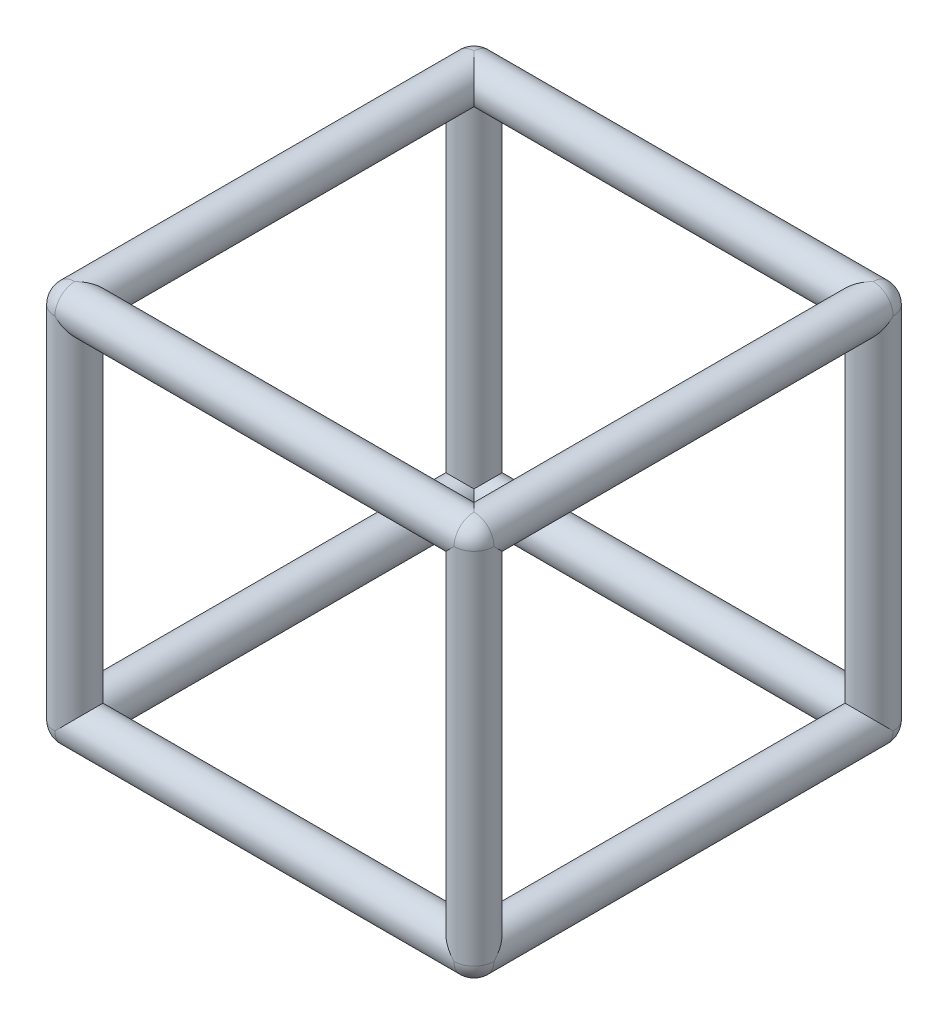
ISO-10303-21;
HEADER;
FILE_DESCRIPTION(('STEP AP214'),'2;1');
FILE_NAME('part.step','',(''),(''),'','','');
FILE_SCHEMA(('AUTOMOTIVE_DESIGN { 1 0 10303 214 1 1 1 1 }'));
ENDSEC;
DATA;
#1=APPLICATION_CONTEXT('core data for automotive mechanical design processes');
#2=APPLICATION_PROTOCOL_DEFINITION('international standard','automotive_design',2000,#1);
#3=PRODUCT_CONTEXT('',#1,'mechanical');
#4=PRODUCT('Part','Part','',(#3));
#5=PRODUCT_RELATED_PRODUCT_CATEGORY('part','',(#4));
#6=PRODUCT_DEFINITION_FORMATION('','',#4);
#7=PRODUCT_DEFINITION_CONTEXT('part definition',#1,'design');
#8=PRODUCT_DEFINITION('design','',#6,#7);
#9=PRODUCT_DEFINITION_SHAPE('','',#8);
#10=(LENGTH_UNIT() NAMED_UNIT(*) SI_UNIT(.MILLI.,.METRE.));
#11=(NAMED_UNIT(*) PLANE_ANGLE_UNIT() SI_UNIT($,.RADIAN.));
#12=(NAMED_UNIT(*) SI_UNIT($,.STERADIAN.) SOLID_ANGLE_UNIT());
#13=UNCERTAINTY_MEASURE_WITH_UNIT(LENGTH_MEASURE(1.E-05),#10,'distance_accuracy_value','');
#14=(GEOMETRIC_REPRESENTATION_CONTEXT(3) GLOBAL_UNCERTAINTY_ASSIGNED_CONTEXT((#13)) GLOBAL_UNIT_ASSIGNED_CONTEXT((#10,
#11,#12)) REPRESENTATION_CONTEXT('',''));
#15=CARTESIAN_POINT('',(0.,0.,0.));
#16=DIRECTION('',(0.,0.,1.));
#17=DIRECTION('',(1.,0.,0.));
#18=AXIS2_PLACEMENT_3D('',#15,#16,#17);
#19=CARTESIAN_POINT('',(-127.,254.,-127.));
#20=DIRECTION('',(0.,-1.,0.));
#21=DIRECTION('',(0.,0.,-1.));
#22=AXIS2_PLACEMENT_3D('',#19,#20,#21);
#23=CYLINDRICAL_SURFACE('',#22,12.7);
#24=CARTESIAN_POINT('',(-127.,241.3,-127.));
#25=DIRECTION('',(0.,-0.707106781186547,-0.707106781186547));
#26=DIRECTION('',(0.,-0.707106781186547,0.707106781186547));
#27=AXIS2_PLACEMENT_3D('',#24,#25,#26);
#28=ELLIPSE('',#27,17.9605122421383,12.7);
#29=CARTESIAN_POINT('',(-139.7,241.3,-127.));
#30=VERTEX_POINT('',#29);
#31=CARTESIAN_POINT('',(-118.019743878931,232.319743878931,-118.019743878931));
#32=VERTEX_POINT('',#31);
#33=EDGE_CURVE('E242',#30,#32,#28,.F.);
#34=ORIENTED_EDGE('',*,*,#33,.F.);
#35=CARTESIAN_POINT('',(-127.,241.3,-127.));
#36=DIRECTION('',(0.,-1.,0.));
#37=DIRECTION('',(0.,0.,-1.));
#38=AXIS2_PLACEMENT_3D('',#35,#36,#37);
#39=CIRCLE('',#38,12.7);
#40=CARTESIAN_POINT('',(-127.,241.3,-139.7));
#41=VERTEX_POINT('',#40);
#42=EDGE_CURVE('E262',#30,#41,#39,.T.);
#43=ORIENTED_EDGE('',*,*,#42,.T.);
#44=CARTESIAN_POINT('',(-127.,241.3,-127.));
#45=DIRECTION('',(-0.707106781186547,-0.707106781186547,0.));
#46=DIRECTION('',(0.707106781186547,-0.707106781186547,0.));
#47=AXIS2_PLACEMENT_3D('',#44,#45,#46);
#48=ELLIPSE('',#47,17.9605122421383,12.7);
#49=EDGE_CURVE('E264',#32,#41,#48,.F.);
#50=ORIENTED_EDGE('',*,*,#49,.F.);
#51=EDGE_LOOP('',(#34,#43,#50));
#52=FACE_BOUND('',#51,.T.);
#53=CARTESIAN_POINT('',(-127.,12.7,-127.));
#54=DIRECTION('',(0.,-0.707106781186547,0.707106781186547));
#55=DIRECTION('',(0.,-0.707106781186547,-0.707106781186547));
#56=AXIS2_PLACEMENT_3D('',#53,#54,#55);
#57=ELLIPSE('',#56,17.9605122421383,12.7);
#58=CARTESIAN_POINT('',(-118.019743878931,21.6802561210692,-118.019743878931));
#59=VERTEX_POINT('',#58);
#60=CARTESIAN_POINT('',(-139.7,12.7,-127.));
#61=VERTEX_POINT('',#60);
#62=EDGE_CURVE('E189',#59,#61,#57,.T.);
#63=ORIENTED_EDGE('',*,*,#62,.F.);
#64=CARTESIAN_POINT('',(-127.,12.7,-127.));
#65=DIRECTION('',(0.707106781186547,-0.707106781186547,0.));
#66=DIRECTION('',(-0.707106781186547,-0.707106781186547,0.));
#67=AXIS2_PLACEMENT_3D('',#64,#65,#66);
#68=ELLIPSE('',#67,17.9605122421383,12.7);
#69=CARTESIAN_POINT('',(-127.,12.7,-139.7));
#70=VERTEX_POINT('',#69);
#71=EDGE_CURVE('E248',#70,#59,#68,.T.);
#72=ORIENTED_EDGE('',*,*,#71,.F.);
#73=CARTESIAN_POINT('',(-127.,12.7,-127.));
#74=DIRECTION('',(0.,-1.,0.));
#75=DIRECTION('',(0.,0.,-1.));
#76=AXIS2_PLACEMENT_3D('',#73,#74,#75);
#77=CIRCLE('',#76,12.7);
#78=EDGE_CURVE('E164',#70,#61,#77,.F.);
#79=ORIENTED_EDGE('',*,*,#78,.T.);
#80=EDGE_LOOP('',(#63,#72,#79));
#81=FACE_BOUND('',#80,.T.);
#82=ADVANCED_FACE('F41',(#52,#81),#23,.T.);
#83=CARTESIAN_POINT('',(127.,241.3,-127.));
#84=DIRECTION('',(-1.,0.,0.));
#85=DIRECTION('',(0.,0.,1.));
#86=AXIS2_PLACEMENT_3D('',#83,#84,#85);
#87=CYLINDRICAL_SURFACE('',#86,12.7);
#88=CARTESIAN_POINT('',(-127.,241.3,-127.));
#89=DIRECTION('',(-0.707106781186547,0.,0.707106781186547));
#90=DIRECTION('',(-0.707106781186547,0.,-0.707106781186547));
#91=AXIS2_PLACEMENT_3D('',#88,#89,#90);
#92=ELLIPSE('',#91,17.9605122421383,12.7);
#93=CARTESIAN_POINT('',(-127.,254.,-127.));
#94=VERTEX_POINT('',#93);
#95=EDGE_CURVE('E241',#32,#94,#92,.T.);
#96=ORIENTED_EDGE('',*,*,#95,.F.);
#97=ORIENTED_EDGE('',*,*,#49,.T.);
#98=CARTESIAN_POINT('',(-127.,241.3,-127.));
#99=DIRECTION('',(1.,0.,0.));
#100=DIRECTION('',(0.,0.,-1.));
#101=AXIS2_PLACEMENT_3D('',#98,#99,#100);
#102=CIRCLE('',#101,12.7);
#103=EDGE_CURVE('E260',#41,#94,#102,.T.);
#104=ORIENTED_EDGE('',*,*,#103,.T.);
#105=EDGE_LOOP('',(#96,#97,#104));
#106=FACE_BOUND('',#105,.T.);
#107=CARTESIAN_POINT('',(127.,241.3,-127.));
#108=DIRECTION('',(-0.707106781186547,0.,-0.707106781186547));
#109=DIRECTION('',(-0.707106781186547,0.,0.707106781186547));
#110=AXIS2_PLACEMENT_3D('',#107,#108,#109);
#111=ELLIPSE('',#110,17.9605122421383,12.7);
#112=CARTESIAN_POINT('',(127.,254.,-127.));
#113=VERTEX_POINT('',#112);
#114=CARTESIAN_POINT('',(118.019743878931,232.319743878931,-118.019743878931));
#115=VERTEX_POINT('',#114);
#116=EDGE_CURVE('E198',#113,#115,#111,.F.);
#117=ORIENTED_EDGE('',*,*,#116,.F.);
#118=CARTESIAN_POINT('',(127.,241.3,-127.));
#119=DIRECTION('',(1.,0.,0.));
#120=DIRECTION('',(0.,0.,-1.));
#121=AXIS2_PLACEMENT_3D('',#118,#119,#120);
#122=CIRCLE('',#121,12.7);
#123=CARTESIAN_POINT('',(127.,241.3,-139.7));
#124=VERTEX_POINT('',#123);
#125=EDGE_CURVE('E259',#124,#113,#122,.T.);
#126=ORIENTED_EDGE('',*,*,#125,.F.);
#127=CARTESIAN_POINT('',(127.,241.3,-127.));
#128=DIRECTION('',(-0.707106781186547,0.707106781186547,0.));
#129=DIRECTION('',(-0.707106781186547,-0.707106781186547,0.));
#130=AXIS2_PLACEMENT_3D('',#127,#128,#129);
#131=ELLIPSE('',#130,17.9605122421383,12.7);
#132=EDGE_CURVE('E253',#115,#124,#131,.F.);
#133=ORIENTED_EDGE('',*,*,#132,.F.);
#134=EDGE_LOOP('',(#117,#126,#133));
#135=FACE_BOUND('',#134,.T.);
#136=ADVANCED_FACE('F329',(#106,#135),#87,.T.);
#137=CARTESIAN_POINT('',(-127.,12.7,-127.));
#138=DIRECTION('',(0.,1.,0.));
#139=DIRECTION('',(0.,0.,1.));
#140=AXIS2_PLACEMENT_3D('',#137,#138,#139);
#141=SPHERICAL_SURFACE('',#140,12.7);
#142=CARTESIAN_POINT('',(-127.,12.7,-127.));
#143=DIRECTION('',(1.,0.,0.));
#144=DIRECTION('',(0.,0.,-1.));
#145=AXIS2_PLACEMENT_3D('',#142,#143,#144);
#146=CIRCLE('',#145,12.7);
#147=CARTESIAN_POINT('',(-127.,0.,-127.));
#148=VERTEX_POINT('',#147);
#149=EDGE_CURVE('E246',#148,#70,#146,.T.);
#150=ORIENTED_EDGE('',*,*,#149,.F.);
#151=CARTESIAN_POINT('',(-127.,12.7,-127.));
#152=DIRECTION('',(0.,0.,1.));
#153=DIRECTION('',(1.,0.,0.));
#154=AXIS2_PLACEMENT_3D('',#151,#152,#153);
#155=CIRCLE('',#154,12.7);
#156=EDGE_CURVE('E57',#61,#148,#155,.T.);
#157=ORIENTED_EDGE('',*,*,#156,.F.);
#158=ORIENTED_EDGE('',*,*,#78,.F.);
#159=EDGE_LOOP('',(#150,#157,#158));
#160=FACE_BOUND('',#159,.T.);
#161=ADVANCED_FACE('F331',(#160),#141,.T.);
#162=CARTESIAN_POINT('',(127.,254.,-127.));
#163=DIRECTION('',(0.,-1.,0.));
#164=DIRECTION('',(0.,0.,-1.));
#165=AXIS2_PLACEMENT_3D('',#162,#163,#164);
#166=CYLINDRICAL_SURFACE('',#165,12.7);
#167=CARTESIAN_POINT('',(127.,12.7,-127.));
#168=DIRECTION('',(0.,-0.707106781186547,0.707106781186547));
#169=DIRECTION('',(0.,-0.707106781186547,-0.707106781186547));
#170=AXIS2_PLACEMENT_3D('',#167,#168,#169);
#171=ELLIPSE('',#170,17.9605122421383,12.7);
#172=CARTESIAN_POINT('',(139.7,12.7,-127.));
#173=VERTEX_POINT('',#172);
#174=CARTESIAN_POINT('',(118.019743878931,21.6802561210692,-118.019743878931));
#175=VERTEX_POINT('',#174);
#176=EDGE_CURVE('E61',#173,#175,#171,.T.);
#177=ORIENTED_EDGE('',*,*,#176,.F.);
#178=CARTESIAN_POINT('',(127.,12.7,-127.));
#179=DIRECTION('',(0.,-1.,0.));
#180=DIRECTION('',(0.,0.,-1.));
#181=AXIS2_PLACEMENT_3D('',#178,#179,#180);
#182=CIRCLE('',#181,12.7);
#183=CARTESIAN_POINT('',(127.,12.7,-139.7));
#184=VERTEX_POINT('',#183);
#185=EDGE_CURVE('E167',#173,#184,#182,.F.);
#186=ORIENTED_EDGE('',*,*,#185,.T.);
#187=CARTESIAN_POINT('',(127.,12.7,-127.));
#188=DIRECTION('',(-0.707106781186547,-0.707106781186547,0.));
#189=DIRECTION('',(0.707106781186547,-0.707106781186547,0.));
#190=AXIS2_PLACEMENT_3D('',#187,#188,#189);
#191=ELLIPSE('',#190,17.9605122421383,12.7);
#192=EDGE_CURVE('E161',#175,#184,#191,.T.);
#193=ORIENTED_EDGE('',*,*,#192,.F.);
#194=EDGE_LOOP('',(#177,#186,#193));
#195=FACE_BOUND('',#194,.T.);
#196=CARTESIAN_POINT('',(127.,241.3,-127.));
#197=DIRECTION('',(0.,-0.707106781186547,-0.707106781186547));
#198=DIRECTION('',(0.,-0.707106781186547,0.707106781186547));
#199=AXIS2_PLACEMENT_3D('',#196,#197,#198);
#200=ELLIPSE('',#199,17.9605122421383,12.7);
#201=CARTESIAN_POINT('',(139.7,241.3,-127.));
#202=VERTEX_POINT('',#201);
#203=EDGE_CURVE('E196',#115,#202,#200,.F.);
#204=ORIENTED_EDGE('',*,*,#203,.F.);
#205=ORIENTED_EDGE('',*,*,#132,.T.);
#206=CARTESIAN_POINT('',(127.,241.3,-127.));
#207=DIRECTION('',(0.,-1.,0.));
#208=DIRECTION('',(0.,0.,-1.));
#209=AXIS2_PLACEMENT_3D('',#206,#207,#208);
#210=CIRCLE('',#209,12.7);
#211=EDGE_CURVE('E252',#124,#202,#210,.T.);
#212=ORIENTED_EDGE('',*,*,#211,.T.);
#213=EDGE_LOOP('',(#204,#205,#212));
#214=FACE_BOUND('',#213,.T.);
#215=ADVANCED_FACE('F338',(#195,#214),#166,.T.);
#216=CARTESIAN_POINT('',(127.,12.7,-127.));
#217=DIRECTION('',(0.,1.,0.));
#218=DIRECTION('',(0.,0.,1.));
#219=AXIS2_PLACEMENT_3D('',#216,#217,#218);
#220=SPHERICAL_SURFACE('',#219,12.7);
#221=ORIENTED_EDGE('',*,*,#185,.F.);
#222=CARTESIAN_POINT('',(127.,12.7,-127.));
#223=DIRECTION('',(0.,0.,1.));
#224=DIRECTION('',(1.,0.,0.));
#225=AXIS2_PLACEMENT_3D('',#222,#223,#224);
#226=CIRCLE('',#225,12.7);
#227=CARTESIAN_POINT('',(127.,0.,-127.));
#228=VERTEX_POINT('',#227);
#229=EDGE_CURVE('E166',#228,#173,#226,.T.);
#230=ORIENTED_EDGE('',*,*,#229,.F.);
#231=CARTESIAN_POINT('',(127.,12.7,-127.));
#232=DIRECTION('',(1.,0.,0.));
#233=DIRECTION('',(0.,0.,-1.));
#234=AXIS2_PLACEMENT_3D('',#231,#232,#233);
#235=CIRCLE('',#234,12.7);
#236=EDGE_CURVE('E160',#184,#228,#235,.F.);
#237=ORIENTED_EDGE('',*,*,#236,.F.);
#238=EDGE_LOOP('',(#221,#230,#237));
#239=FACE_BOUND('',#238,.T.);
#240=ADVANCED_FACE('F169',(#239),#220,.T.);
#241=CARTESIAN_POINT('',(127.,241.3,-127.));
#242=DIRECTION('',(0.,1.,0.));
#243=DIRECTION('',(0.,0.,1.));
#244=AXIS2_PLACEMENT_3D('',#241,#242,#243);
#245=SPHERICAL_SURFACE('',#244,12.7);
#246=ORIENTED_EDGE('',*,*,#125,.T.);
#247=CARTESIAN_POINT('',(127.,241.3,-127.));
#248=DIRECTION('',(0.,0.,1.));
#249=DIRECTION('',(1.,0.,0.));
#250=AXIS2_PLACEMENT_3D('',#247,#248,#249);
#251=CIRCLE('',#250,12.7);
#252=EDGE_CURVE('E294',#202,#113,#251,.T.);
#253=ORIENTED_EDGE('',*,*,#252,.F.);
#254=ORIENTED_EDGE('',*,*,#211,.F.);
#255=EDGE_LOOP('',(#246,#253,#254));
#256=FACE_BOUND('',#255,.T.);
#257=ADVANCED_FACE('F325',(#256),#245,.T.);
#258=CARTESIAN_POINT('',(127.,12.7,-127.));
#259=DIRECTION('',(-1.,0.,0.));
#260=DIRECTION('',(0.,0.,1.));
#261=AXIS2_PLACEMENT_3D('',#258,#259,#260);
#262=CYLINDRICAL_SURFACE('',#261,12.7);
#263=CARTESIAN_POINT('',(127.,12.7,-127.));
#264=DIRECTION('',(-0.707106781186547,0.,-0.707106781186547));
#265=DIRECTION('',(-0.707106781186547,0.,0.707106781186547));
#266=AXIS2_PLACEMENT_3D('',#263,#264,#265);
#267=ELLIPSE('',#266,17.9605122421383,12.7);
#268=EDGE_CURVE('E162',#175,#228,#267,.F.);
#269=ORIENTED_EDGE('',*,*,#268,.F.);
#270=ORIENTED_EDGE('',*,*,#192,.T.);
#271=ORIENTED_EDGE('',*,*,#236,.T.);
#272=EDGE_LOOP('',(#269,#270,#271));
#273=FACE_BOUND('',#272,.T.);
#274=CARTESIAN_POINT('',(-127.,12.7,-127.));
#275=DIRECTION('',(-0.707106781186547,0.,0.707106781186547));
#276=DIRECTION('',(-0.707106781186547,0.,-0.707106781186547));
#277=AXIS2_PLACEMENT_3D('',#274,#275,#276);
#278=ELLIPSE('',#277,17.9605122421383,12.7);
#279=EDGE_CURVE('E184',#148,#59,#278,.T.);
#280=ORIENTED_EDGE('',*,*,#279,.F.);
#281=ORIENTED_EDGE('',*,*,#149,.T.);
#282=ORIENTED_EDGE('',*,*,#71,.T.);
#283=EDGE_LOOP('',(#280,#281,#282));
#284=FACE_BOUND('',#283,.T.);
#285=ADVANCED_FACE('F157',(#273,#284),#262,.T.);
#286=CARTESIAN_POINT('',(-127.,254.,127.));
#287=DIRECTION('',(0.,-1.,0.));
#288=DIRECTION('',(0.,0.,-1.));
#289=AXIS2_PLACEMENT_3D('',#286,#287,#288);
#290=CYLINDRICAL_SURFACE('',#289,12.7);
#291=CARTESIAN_POINT('',(-127.,241.3,127.));
#292=DIRECTION('',(0.,-1.,0.));
#293=DIRECTION('',(0.,0.,-1.));
#294=AXIS2_PLACEMENT_3D('',#291,#292,#293);
#295=CIRCLE('',#294,12.7);
#296=CARTESIAN_POINT('',(-127.,241.3,139.7));
#297=VERTEX_POINT('',#296);
#298=CARTESIAN_POINT('',(-139.7,241.3,127.));
#299=VERTEX_POINT('',#298);
#300=EDGE_CURVE('E222',#297,#299,#295,.T.);
#301=ORIENTED_EDGE('',*,*,#300,.T.);
#302=CARTESIAN_POINT('',(-127.,241.3,127.));
#303=DIRECTION('',(0.,0.707106781186547,-0.707106781186547));
#304=DIRECTION('',(0.,-0.707106781186547,-0.707106781186547));
#305=AXIS2_PLACEMENT_3D('',#302,#303,#304);
#306=ELLIPSE('',#305,17.9605122421383,12.7);
#307=CARTESIAN_POINT('',(-118.019743878931,232.319743878931,118.019743878931));
#308=VERTEX_POINT('',#307);
#309=EDGE_CURVE('E234',#299,#308,#306,.F.);
#310=ORIENTED_EDGE('',*,*,#309,.T.);
#311=CARTESIAN_POINT('',(-127.,241.3,127.));
#312=DIRECTION('',(-0.707106781186547,-0.707106781186547,0.));
#313=DIRECTION('',(0.707106781186547,-0.707106781186547,0.));
#314=AXIS2_PLACEMENT_3D('',#311,#312,#313);
#315=ELLIPSE('',#314,17.9605122421383,12.7);
#316=EDGE_CURVE('E217',#297,#308,#315,.F.);
#317=ORIENTED_EDGE('',*,*,#316,.F.);
#318=EDGE_LOOP('',(#301,#310,#317));
#319=FACE_BOUND('',#318,.T.);
#320=CARTESIAN_POINT('',(-127.,12.7,127.));
#321=DIRECTION('',(0.,-0.707106781186547,-0.707106781186547));
#322=DIRECTION('',(0.,-0.707106781186547,0.707106781186547));
#323=AXIS2_PLACEMENT_3D('',#320,#321,#322);
#324=ELLIPSE('',#323,17.9605122421383,12.7);
#325=CARTESIAN_POINT('',(-139.7,12.7,127.));
#326=VERTEX_POINT('',#325);
#327=CARTESIAN_POINT('',(-118.019743878931,21.6802561210692,118.019743878931));
#328=VERTEX_POINT('',#327);
#329=EDGE_CURVE('E180',#326,#328,#324,.T.);
#330=ORIENTED_EDGE('',*,*,#329,.F.);
#331=CARTESIAN_POINT('',(-127.,12.7,127.));
#332=DIRECTION('',(0.,-1.,0.));
#333=DIRECTION('',(0.,0.,-1.));
#334=AXIS2_PLACEMENT_3D('',#331,#332,#333);
#335=CIRCLE('',#334,12.7);
#336=CARTESIAN_POINT('',(-127.,12.7,139.7));
#337=VERTEX_POINT('',#336);
#338=EDGE_CURVE('E227',#326,#337,#335,.F.);
#339=ORIENTED_EDGE('',*,*,#338,.T.);
#340=CARTESIAN_POINT('',(-127.,12.7,127.));
#341=DIRECTION('',(0.707106781186547,-0.707106781186547,0.));
#342=DIRECTION('',(-0.707106781186547,-0.707106781186547,0.));
#343=AXIS2_PLACEMENT_3D('',#340,#341,#342);
#344=ELLIPSE('',#343,17.9605122421383,12.7);
#345=EDGE_CURVE('E204',#328,#337,#344,.T.);
#346=ORIENTED_EDGE('',*,*,#345,.F.);
#347=EDGE_LOOP('',(#330,#339,#346));
#348=FACE_BOUND('',#347,.T.);
#349=ADVANCED_FACE('F315',(#319,#348),#290,.T.);
#350=CARTESIAN_POINT('',(127.,241.3,127.));
#351=DIRECTION('',(-1.,0.,0.));
#352=DIRECTION('',(0.,0.,1.));
#353=AXIS2_PLACEMENT_3D('',#350,#351,#352);
#354=CYLINDRICAL_SURFACE('',#353,12.7);
#355=ORIENTED_EDGE('',*,*,#316,.T.);
#356=CARTESIAN_POINT('',(-127.,241.3,127.));
#357=DIRECTION('',(-0.707106781186547,0.,-0.707106781186547));
#358=DIRECTION('',(0.707106781186547,0.,-0.707106781186547));
#359=AXIS2_PLACEMENT_3D('',#356,#357,#358);
#360=ELLIPSE('',#359,17.9605122421383,12.7);
#361=CARTESIAN_POINT('',(-127.,254.,127.));
#362=VERTEX_POINT('',#361);
#363=EDGE_CURVE('E233',#308,#362,#360,.F.);
#364=ORIENTED_EDGE('',*,*,#363,.T.);
#365=CARTESIAN_POINT('',(-127.,241.3,127.));
#366=DIRECTION('',(1.,0.,0.));
#367=DIRECTION('',(0.,0.,-1.));
#368=AXIS2_PLACEMENT_3D('',#365,#366,#367);
#369=CIRCLE('',#368,12.7);
#370=EDGE_CURVE('E216',#362,#297,#369,.T.);
#371=ORIENTED_EDGE('',*,*,#370,.T.);
#372=EDGE_LOOP('',(#355,#364,#371));
#373=FACE_BOUND('',#372,.T.);
#374=CARTESIAN_POINT('',(127.,241.3,127.));
#375=DIRECTION('',(-0.707106781186547,0.,0.707106781186547));
#376=DIRECTION('',(-0.707106781186547,0.,-0.707106781186547));
#377=AXIS2_PLACEMENT_3D('',#374,#375,#376);
#378=ELLIPSE('',#377,17.9605122421383,12.7);
#379=CARTESIAN_POINT('',(118.019743878931,232.319743878931,118.019743878931));
#380=VERTEX_POINT('',#379);
#381=CARTESIAN_POINT('',(127.,254.,127.));
#382=VERTEX_POINT('',#381);
#383=EDGE_CURVE('E191',#380,#382,#378,.F.);
#384=ORIENTED_EDGE('',*,*,#383,.F.);
#385=CARTESIAN_POINT('',(127.,241.3,127.));
#386=DIRECTION('',(-0.707106781186547,0.707106781186547,0.));
#387=DIRECTION('',(-0.707106781186547,-0.707106781186547,0.));
#388=AXIS2_PLACEMENT_3D('',#385,#386,#387);
#389=ELLIPSE('',#388,17.9605122421383,12.7);
#390=CARTESIAN_POINT('',(127.,241.3,139.7));
#391=VERTEX_POINT('',#390);
#392=EDGE_CURVE('E211',#391,#380,#389,.F.);
#393=ORIENTED_EDGE('',*,*,#392,.F.);
#394=CARTESIAN_POINT('',(127.,241.3,127.));
#395=DIRECTION('',(1.,0.,0.));
#396=DIRECTION('',(0.,0.,-1.));
#397=AXIS2_PLACEMENT_3D('',#394,#395,#396);
#398=CIRCLE('',#397,12.7);
#399=EDGE_CURVE('E220',#382,#391,#398,.T.);
#400=ORIENTED_EDGE('',*,*,#399,.F.);
#401=EDGE_LOOP('',(#384,#393,#400));
#402=FACE_BOUND('',#401,.T.);
#403=ADVANCED_FACE('F283',(#373,#402),#354,.T.);
#404=CARTESIAN_POINT('',(127.,254.,127.));
#405=DIRECTION('',(0.,-1.,0.));
#406=DIRECTION('',(0.,0.,-1.));
#407=AXIS2_PLACEMENT_3D('',#404,#405,#406);
#408=CYLINDRICAL_SURFACE('',#407,12.7);
#409=CARTESIAN_POINT('',(127.,12.7,127.));
#410=DIRECTION('',(0.,-0.707106781186547,-0.707106781186547));
#411=DIRECTION('',(0.,-0.707106781186547,0.707106781186547));
#412=AXIS2_PLACEMENT_3D('',#409,#410,#411);
#413=ELLIPSE('',#412,17.9605122421383,12.7);
#414=CARTESIAN_POINT('',(118.019743878931,21.6802561210692,118.019743878931));
#415=VERTEX_POINT('',#414);
#416=CARTESIAN_POINT('',(139.7,12.7,127.));
#417=VERTEX_POINT('',#416);
#418=EDGE_CURVE('E174',#415,#417,#413,.T.);
#419=ORIENTED_EDGE('',*,*,#418,.F.);
#420=CARTESIAN_POINT('',(127.,12.7,127.));
#421=DIRECTION('',(-0.707106781186547,-0.707106781186547,0.));
#422=DIRECTION('',(0.707106781186547,-0.707106781186547,0.));
#423=AXIS2_PLACEMENT_3D('',#420,#421,#422);
#424=ELLIPSE('',#423,17.9605122421383,12.7);
#425=CARTESIAN_POINT('',(127.,12.7,139.7));
#426=VERTEX_POINT('',#425);
#427=EDGE_CURVE('E201',#426,#415,#424,.T.);
#428=ORIENTED_EDGE('',*,*,#427,.F.);
#429=CARTESIAN_POINT('',(127.,12.7,127.));
#430=DIRECTION('',(0.,-1.,0.));
#431=DIRECTION('',(0.,0.,-1.));
#432=AXIS2_PLACEMENT_3D('',#429,#430,#431);
#433=CIRCLE('',#432,12.7);
#434=EDGE_CURVE('E212',#426,#417,#433,.F.);
#435=ORIENTED_EDGE('',*,*,#434,.T.);
#436=EDGE_LOOP('',(#419,#428,#435));
#437=FACE_BOUND('',#436,.T.);
#438=CARTESIAN_POINT('',(127.,241.3,127.));
#439=DIRECTION('',(0.,-0.707106781186547,0.707106781186547));
#440=DIRECTION('',(0.,-0.707106781186547,-0.707106781186547));
#441=AXIS2_PLACEMENT_3D('',#438,#439,#440);
#442=ELLIPSE('',#441,17.9605122421383,12.7);
#443=CARTESIAN_POINT('',(139.7,241.3,127.));
#444=VERTEX_POINT('',#443);
#445=EDGE_CURVE('E192',#444,#380,#442,.F.);
#446=ORIENTED_EDGE('',*,*,#445,.F.);
#447=CARTESIAN_POINT('',(127.,241.3,127.));
#448=DIRECTION('',(0.,-1.,0.));
#449=DIRECTION('',(0.,0.,-1.));
#450=AXIS2_PLACEMENT_3D('',#447,#448,#449);
#451=CIRCLE('',#450,12.7);
#452=EDGE_CURVE('E206',#444,#391,#451,.T.);
#453=ORIENTED_EDGE('',*,*,#452,.T.);
#454=ORIENTED_EDGE('',*,*,#392,.T.);
#455=EDGE_LOOP('',(#446,#453,#454));
#456=FACE_BOUND('',#455,.T.);
#457=ADVANCED_FACE('F284',(#437,#456),#408,.T.);
#458=CARTESIAN_POINT('',(127.,12.7,127.));
#459=DIRECTION('',(-1.,0.,0.));
#460=DIRECTION('',(0.,0.,1.));
#461=AXIS2_PLACEMENT_3D('',#458,#459,#460);
#462=CYLINDRICAL_SURFACE('',#461,12.7);
#463=CARTESIAN_POINT('',(127.,12.7,127.));
#464=DIRECTION('',(-0.707106781186547,0.,0.707106781186547));
#465=DIRECTION('',(-0.707106781186547,0.,-0.707106781186547));
#466=AXIS2_PLACEMENT_3D('',#463,#464,#465);
#467=ELLIPSE('',#466,17.9605122421383,12.7);
#468=CARTESIAN_POINT('',(127.,0.,127.));
#469=VERTEX_POINT('',#468);
#470=EDGE_CURVE('E47',#469,#415,#467,.F.);
#471=ORIENTED_EDGE('',*,*,#470,.F.);
#472=CARTESIAN_POINT('',(127.,12.7,127.));
#473=DIRECTION('',(1.,0.,0.));
#474=DIRECTION('',(0.,0.,-1.));
#475=AXIS2_PLACEMENT_3D('',#472,#473,#474);
#476=CIRCLE('',#475,12.7);
#477=EDGE_CURVE('E230',#469,#426,#476,.F.);
#478=ORIENTED_EDGE('',*,*,#477,.T.);
#479=ORIENTED_EDGE('',*,*,#427,.T.);
#480=EDGE_LOOP('',(#471,#478,#479));
#481=FACE_BOUND('',#480,.T.);
#482=CARTESIAN_POINT('',(-127.,12.7,127.));
#483=DIRECTION('',(-0.707106781186547,0.,-0.707106781186547));
#484=DIRECTION('',(-0.707106781186547,0.,0.707106781186547));
#485=AXIS2_PLACEMENT_3D('',#482,#483,#484);
#486=ELLIPSE('',#485,17.9605122421383,12.7);
#487=CARTESIAN_POINT('',(-127.,0.,127.));
#488=VERTEX_POINT('',#487);
#489=EDGE_CURVE('E11',#328,#488,#486,.T.);
#490=ORIENTED_EDGE('',*,*,#489,.F.);
#491=ORIENTED_EDGE('',*,*,#345,.T.);
#492=CARTESIAN_POINT('',(-127.,12.7,127.));
#493=DIRECTION('',(1.,0.,0.));
#494=DIRECTION('',(0.,0.,-1.));
#495=AXIS2_PLACEMENT_3D('',#492,#493,#494);
#496=CIRCLE('',#495,12.7);
#497=EDGE_CURVE('E203',#337,#488,#496,.T.);
#498=ORIENTED_EDGE('',*,*,#497,.T.);
#499=EDGE_LOOP('',(#490,#491,#498));
#500=FACE_BOUND('',#499,.T.);
#501=ADVANCED_FACE('F274',(#481,#500),#462,.T.);
#502=CARTESIAN_POINT('',(-127.,241.3,127.));
#503=DIRECTION('',(0.,0.,-1.));
#504=DIRECTION('',(-1.,0.,0.));
#505=AXIS2_PLACEMENT_3D('',#502,#503,#504);
#506=CYLINDRICAL_SURFACE('',#505,12.7);
#507=CARTESIAN_POINT('',(-127.,241.3,-127.));
#508=DIRECTION('',(0.,0.,1.));
#509=DIRECTION('',(1.,0.,0.));
#510=AXIS2_PLACEMENT_3D('',#507,#508,#509);
#511=CIRCLE('',#510,12.7);
#512=EDGE_CURVE('E240',#94,#30,#511,.T.);
#513=ORIENTED_EDGE('',*,*,#512,.T.);
#514=ORIENTED_EDGE('',*,*,#33,.T.);
#515=ORIENTED_EDGE('',*,*,#95,.T.);
#516=EDGE_LOOP('',(#513,#514,#515));
#517=FACE_BOUND('',#516,.T.);
#518=ORIENTED_EDGE('',*,*,#309,.F.);
#519=CARTESIAN_POINT('',(-127.,241.3,127.));
#520=DIRECTION('',(0.,0.,1.));
#521=DIRECTION('',(1.,0.,0.));
#522=AXIS2_PLACEMENT_3D('',#519,#520,#521);
#523=CIRCLE('',#522,12.7);
#524=EDGE_CURVE('E238',#362,#299,#523,.T.);
#525=ORIENTED_EDGE('',*,*,#524,.F.);
#526=ORIENTED_EDGE('',*,*,#363,.F.);
#527=EDGE_LOOP('',(#518,#525,#526));
#528=FACE_BOUND('',#527,.T.);
#529=ADVANCED_FACE('F356',(#517,#528),#506,.T.);
#530=CARTESIAN_POINT('',(-127.,241.3,-127.));
#531=DIRECTION('',(0.,1.,0.));
#532=DIRECTION('',(0.,0.,1.));
#533=AXIS2_PLACEMENT_3D('',#530,#531,#532);
#534=SPHERICAL_SURFACE('',#533,12.7);
#535=ORIENTED_EDGE('',*,*,#42,.F.);
#536=ORIENTED_EDGE('',*,*,#512,.F.);
#537=ORIENTED_EDGE('',*,*,#103,.F.);
#538=EDGE_LOOP('',(#535,#536,#537));
#539=FACE_BOUND('',#538,.T.);
#540=ADVANCED_FACE('F43',(#539),#534,.T.);
#541=CARTESIAN_POINT('',(-127.,12.7,127.));
#542=DIRECTION('',(0.,1.,0.));
#543=DIRECTION('',(0.,0.,1.));
#544=AXIS2_PLACEMENT_3D('',#541,#542,#543);
#545=SPHERICAL_SURFACE('',#544,12.7);
#546=CARTESIAN_POINT('',(-127.,12.7,127.));
#547=DIRECTION('',(0.,0.,1.));
#548=DIRECTION('',(1.,0.,0.));
#549=AXIS2_PLACEMENT_3D('',#546,#547,#548);
#550=CIRCLE('',#549,12.7);
#551=EDGE_CURVE('E179',#326,#488,#550,.T.);
#552=ORIENTED_EDGE('',*,*,#551,.T.);
#553=ORIENTED_EDGE('',*,*,#497,.F.);
#554=ORIENTED_EDGE('',*,*,#338,.F.);
#555=EDGE_LOOP('',(#552,#553,#554));
#556=FACE_BOUND('',#555,.T.);
#557=ADVANCED_FACE('F306',(#556),#545,.T.);
#558=CARTESIAN_POINT('',(-127.,241.3,127.));
#559=DIRECTION('',(0.,1.,0.));
#560=DIRECTION('',(0.,0.,1.));
#561=AXIS2_PLACEMENT_3D('',#558,#559,#560);
#562=SPHERICAL_SURFACE('',#561,12.7);
#563=ORIENTED_EDGE('',*,*,#370,.F.);
#564=ORIENTED_EDGE('',*,*,#524,.T.);
#565=ORIENTED_EDGE('',*,*,#300,.F.);
#566=EDGE_LOOP('',(#563,#564,#565));
#567=FACE_BOUND('',#566,.T.);
#568=ADVANCED_FACE('F365',(#567),#562,.T.);
#569=CARTESIAN_POINT('',(127.,12.7,127.));
#570=DIRECTION('',(0.,1.,0.));
#571=DIRECTION('',(0.,0.,1.));
#572=AXIS2_PLACEMENT_3D('',#569,#570,#571);
#573=SPHERICAL_SURFACE('',#572,12.7);
#574=CARTESIAN_POINT('',(127.,12.7,127.));
#575=DIRECTION('',(0.,0.,1.));
#576=DIRECTION('',(1.,0.,0.));
#577=AXIS2_PLACEMENT_3D('',#574,#575,#576);
#578=CIRCLE('',#577,12.7);
#579=EDGE_CURVE('E175',#469,#417,#578,.T.);
#580=ORIENTED_EDGE('',*,*,#579,.T.);
#581=ORIENTED_EDGE('',*,*,#434,.F.);
#582=ORIENTED_EDGE('',*,*,#477,.F.);
#583=EDGE_LOOP('',(#580,#581,#582));
#584=FACE_BOUND('',#583,.T.);
#585=ADVANCED_FACE('F276',(#584),#573,.T.);
#586=CARTESIAN_POINT('',(127.,241.3,127.));
#587=DIRECTION('',(0.,1.,0.));
#588=DIRECTION('',(0.,0.,1.));
#589=AXIS2_PLACEMENT_3D('',#586,#587,#588);
#590=SPHERICAL_SURFACE('',#589,12.7);
#591=CARTESIAN_POINT('',(127.,241.3,127.));
#592=DIRECTION('',(0.,0.,1.));
#593=DIRECTION('',(1.,0.,0.));
#594=AXIS2_PLACEMENT_3D('',#591,#592,#593);
#595=CIRCLE('',#594,12.7);
#596=EDGE_CURVE('E289',#444,#382,#595,.T.);
#597=ORIENTED_EDGE('',*,*,#596,.T.);
#598=ORIENTED_EDGE('',*,*,#399,.T.);
#599=ORIENTED_EDGE('',*,*,#452,.F.);
#600=EDGE_LOOP('',(#597,#598,#599));
#601=FACE_BOUND('',#600,.T.);
#602=ADVANCED_FACE('F352',(#601),#590,.T.);
#603=CARTESIAN_POINT('',(127.,12.7,127.));
#604=DIRECTION('',(0.,0.,-1.));
#605=DIRECTION('',(-1.,0.,0.));
#606=AXIS2_PLACEMENT_3D('',#603,#604,#605);
#607=CYLINDRICAL_SURFACE('',#606,12.7);
#608=ORIENTED_EDGE('',*,*,#470,.T.);
#609=ORIENTED_EDGE('',*,*,#418,.T.);
#610=ORIENTED_EDGE('',*,*,#579,.F.);
#611=EDGE_LOOP('',(#608,#609,#610));
#612=FACE_BOUND('',#611,.T.);
#613=ORIENTED_EDGE('',*,*,#229,.T.);
#614=ORIENTED_EDGE('',*,*,#176,.T.);
#615=ORIENTED_EDGE('',*,*,#268,.T.);
#616=EDGE_LOOP('',(#613,#614,#615));
#617=FACE_BOUND('',#616,.T.);
#618=ADVANCED_FACE('F172',(#612,#617),#607,.T.);
#619=CARTESIAN_POINT('',(-127.,12.7,127.));
#620=DIRECTION('',(0.,0.,-1.));
#621=DIRECTION('',(-1.,0.,0.));
#622=AXIS2_PLACEMENT_3D('',#619,#620,#621);
#623=CYLINDRICAL_SURFACE('',#622,12.7);
#624=ORIENTED_EDGE('',*,*,#551,.F.);
#625=ORIENTED_EDGE('',*,*,#329,.T.);
#626=ORIENTED_EDGE('',*,*,#489,.T.);
#627=EDGE_LOOP('',(#624,#625,#626));
#628=FACE_BOUND('',#627,.T.);
#629=ORIENTED_EDGE('',*,*,#279,.T.);
#630=ORIENTED_EDGE('',*,*,#62,.T.);
#631=ORIENTED_EDGE('',*,*,#156,.T.);
#632=EDGE_LOOP('',(#629,#630,#631));
#633=FACE_BOUND('',#632,.T.);
#634=ADVANCED_FACE('F308',(#628,#633),#623,.T.);
#635=CARTESIAN_POINT('',(127.,241.3,127.));
#636=DIRECTION('',(0.,0.,-1.));
#637=DIRECTION('',(-1.,0.,0.));
#638=AXIS2_PLACEMENT_3D('',#635,#636,#637);
#639=CYLINDRICAL_SURFACE('',#638,12.7);
#640=ORIENTED_EDGE('',*,*,#445,.T.);
#641=ORIENTED_EDGE('',*,*,#383,.T.);
#642=ORIENTED_EDGE('',*,*,#596,.F.);
#643=EDGE_LOOP('',(#640,#641,#642));
#644=FACE_BOUND('',#643,.T.);
#645=ORIENTED_EDGE('',*,*,#252,.T.);
#646=ORIENTED_EDGE('',*,*,#116,.T.);
#647=ORIENTED_EDGE('',*,*,#203,.T.);
#648=EDGE_LOOP('',(#645,#646,#647));
#649=FACE_BOUND('',#648,.T.);
#650=ADVANCED_FACE('F293',(#644,#649),#639,.T.);
#651=CLOSED_SHELL('',(#82,#136,#161,#215,#240,#257,#285,#349,#403,#457,#501,#529,#540,#557,#568,
#585,#602,#618,#634,#650));
#652=MANIFOLD_SOLID_BREP('B2',#651);
#653=ADVANCED_BREP_SHAPE_REPRESENTATION('',(#18,#652),#14);
#654=SHAPE_DEFINITION_REPRESENTATION(#9,#653);
ENDSEC;
END-ISO-10303-21;
